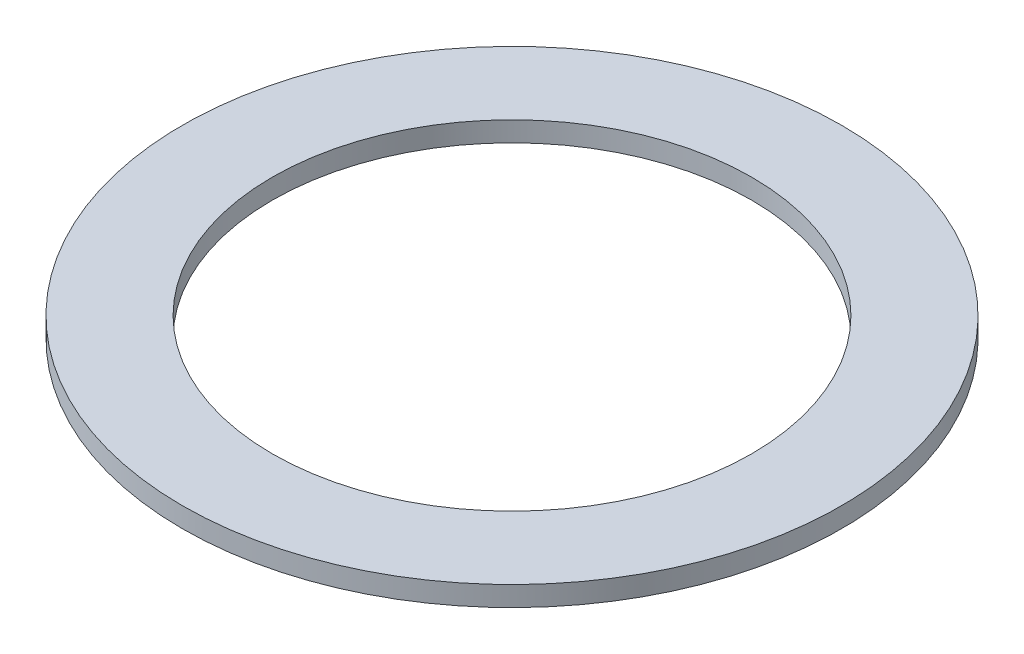
ISO-10303-21;
HEADER;
FILE_DESCRIPTION(('STEP AP214'),'2;1');
FILE_NAME('part.step','',(''),(''),'','','');
FILE_SCHEMA(('AUTOMOTIVE_DESIGN { 1 0 10303 214 1 1 1 1 }'));
ENDSEC;
DATA;
#1=APPLICATION_CONTEXT('core data for automotive mechanical design processes');
#2=APPLICATION_PROTOCOL_DEFINITION('international standard','automotive_design',2000,#1);
#3=PRODUCT_CONTEXT('',#1,'mechanical');
#4=PRODUCT('Part','Part','',(#3));
#5=PRODUCT_RELATED_PRODUCT_CATEGORY('part','',(#4));
#6=PRODUCT_DEFINITION_FORMATION('','',#4);
#7=PRODUCT_DEFINITION_CONTEXT('part definition',#1,'design');
#8=PRODUCT_DEFINITION('design','',#6,#7);
#9=PRODUCT_DEFINITION_SHAPE('','',#8);
#10=(LENGTH_UNIT() NAMED_UNIT(*) SI_UNIT(.MILLI.,.METRE.));
#11=(NAMED_UNIT(*) PLANE_ANGLE_UNIT() SI_UNIT($,.RADIAN.));
#12=(NAMED_UNIT(*) SI_UNIT($,.STERADIAN.) SOLID_ANGLE_UNIT());
#13=UNCERTAINTY_MEASURE_WITH_UNIT(LENGTH_MEASURE(1.E-05),#10,'distance_accuracy_value','');
#14=(GEOMETRIC_REPRESENTATION_CONTEXT(3) GLOBAL_UNCERTAINTY_ASSIGNED_CONTEXT((#13)) GLOBAL_UNIT_ASSIGNED_CONTEXT((#10,
#11,#12)) REPRESENTATION_CONTEXT('',''));
#15=CARTESIAN_POINT('',(0.,0.,0.));
#16=DIRECTION('',(0.,0.,1.));
#17=DIRECTION('',(1.,0.,0.));
#18=AXIS2_PLACEMENT_3D('',#15,#16,#17);
#19=CARTESIAN_POINT('',(0.,1.,0.));
#20=DIRECTION('',(0.,1.,0.));
#21=DIRECTION('',(0.,0.,1.));
#22=AXIS2_PLACEMENT_3D('',#19,#20,#21);
#23=PLANE('',#22);
#24=CARTESIAN_POINT('',(0.,1.,0.));
#25=DIRECTION('',(0.,1.,0.));
#26=DIRECTION('',(0.,0.,1.));
#27=AXIS2_PLACEMENT_3D('',#24,#25,#26);
#28=CIRCLE('',#27,16.5);
#29=CARTESIAN_POINT('',(0.,1.,16.5));
#30=VERTEX_POINT('',#29);
#31=EDGE_CURVE('E10',#30,#30,#28,.T.);
#32=ORIENTED_EDGE('',*,*,#31,.T.);
#33=EDGE_LOOP('',(#32));
#34=FACE_BOUND('',#33,.T.);
#35=CARTESIAN_POINT('',(0.,1.,0.));
#36=DIRECTION('',(0.,1.,0.));
#37=DIRECTION('',(0.,0.,1.));
#38=AXIS2_PLACEMENT_3D('',#35,#36,#37);
#39=CIRCLE('',#38,12.);
#40=CARTESIAN_POINT('',(0.,1.,12.));
#41=VERTEX_POINT('',#40);
#42=EDGE_CURVE('E41',#41,#41,#39,.T.);
#43=ORIENTED_EDGE('',*,*,#42,.F.);
#44=EDGE_LOOP('',(#43));
#45=FACE_BOUND('',#44,.T.);
#46=ADVANCED_FACE('F30',(#34,#45),#23,.T.);
#47=CARTESIAN_POINT('',(0.,0.,0.));
#48=DIRECTION('',(0.,1.,0.));
#49=DIRECTION('',(0.,0.,1.));
#50=AXIS2_PLACEMENT_3D('',#47,#48,#49);
#51=PLANE('',#50);
#52=CARTESIAN_POINT('',(0.,0.,0.));
#53=DIRECTION('',(0.,1.,0.));
#54=DIRECTION('',(0.,0.,1.));
#55=AXIS2_PLACEMENT_3D('',#52,#53,#54);
#56=CIRCLE('',#55,16.5);
#57=CARTESIAN_POINT('',(0.,0.,16.5));
#58=VERTEX_POINT('',#57);
#59=EDGE_CURVE('E34',#58,#58,#56,.T.);
#60=ORIENTED_EDGE('',*,*,#59,.F.);
#61=EDGE_LOOP('',(#60));
#62=FACE_BOUND('',#61,.T.);
#63=CARTESIAN_POINT('',(0.,0.,0.));
#64=DIRECTION('',(0.,1.,0.));
#65=DIRECTION('',(0.,0.,1.));
#66=AXIS2_PLACEMENT_3D('',#63,#64,#65);
#67=CIRCLE('',#66,12.);
#68=CARTESIAN_POINT('',(0.,0.,12.));
#69=VERTEX_POINT('',#68);
#70=EDGE_CURVE('E43',#69,#69,#67,.T.);
#71=ORIENTED_EDGE('',*,*,#70,.T.);
#72=EDGE_LOOP('',(#71));
#73=FACE_BOUND('',#72,.T.);
#74=ADVANCED_FACE('F53',(#62,#73),#51,.F.);
#75=CARTESIAN_POINT('',(0.,1.,0.));
#76=DIRECTION('',(0.,-1.,0.));
#77=DIRECTION('',(0.,0.,-1.));
#78=AXIS2_PLACEMENT_3D('',#75,#76,#77);
#79=CYLINDRICAL_SURFACE('',#78,16.5);
#80=ORIENTED_EDGE('',*,*,#31,.F.);
#81=EDGE_LOOP('',(#80));
#82=FACE_BOUND('',#81,.T.);
#83=ORIENTED_EDGE('',*,*,#59,.T.);
#84=EDGE_LOOP('',(#83));
#85=FACE_BOUND('',#84,.T.);
#86=ADVANCED_FACE('F32',(#82,#85),#79,.T.);
#87=CARTESIAN_POINT('',(0.,1.,0.));
#88=DIRECTION('',(0.,-1.,0.));
#89=DIRECTION('',(0.,0.,-1.));
#90=AXIS2_PLACEMENT_3D('',#87,#88,#89);
#91=CYLINDRICAL_SURFACE('',#90,12.);
#92=ORIENTED_EDGE('',*,*,#42,.T.);
#93=EDGE_LOOP('',(#92));
#94=FACE_BOUND('',#93,.T.);
#95=ORIENTED_EDGE('',*,*,#70,.F.);
#96=EDGE_LOOP('',(#95));
#97=FACE_BOUND('',#96,.T.);
#98=ADVANCED_FACE('F49',(#94,#97),#91,.F.);
#99=CLOSED_SHELL('',(#46,#74,#86,#98));
#100=MANIFOLD_SOLID_BREP('B2',#99);
#101=ADVANCED_BREP_SHAPE_REPRESENTATION('',(#18,#100),#14);
#102=SHAPE_DEFINITION_REPRESENTATION(#9,#101);
ENDSEC;
END-ISO-10303-21;
